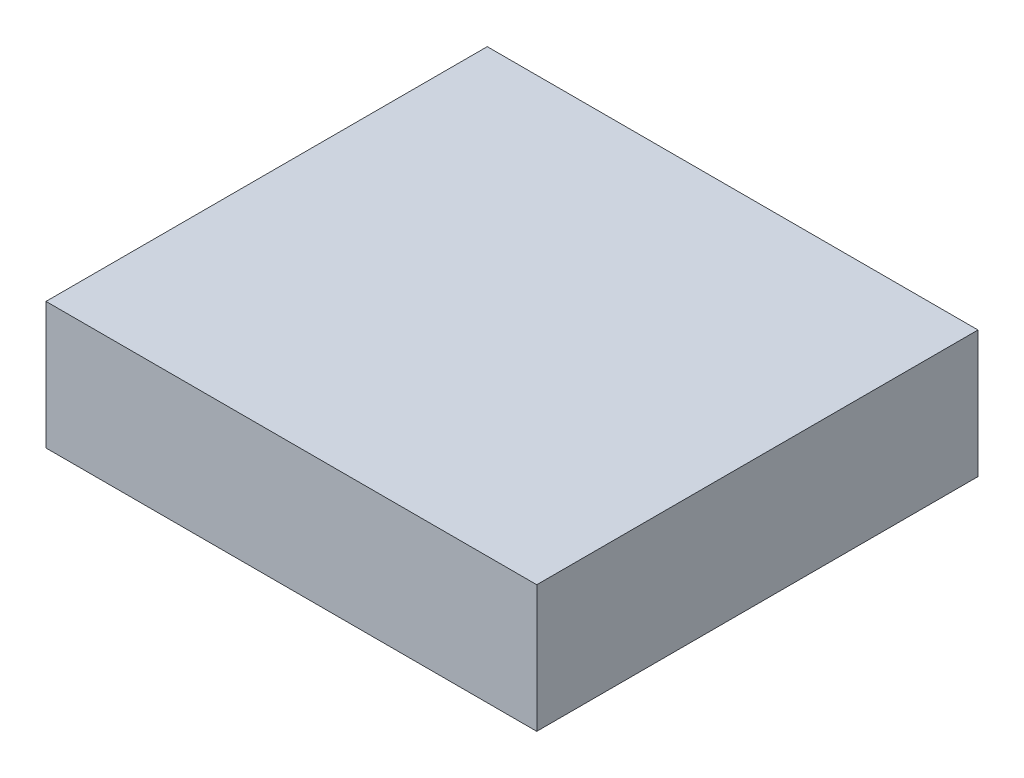
ISO-10303-21;
HEADER;
FILE_DESCRIPTION(('STEP AP214'),'2;1');
FILE_NAME('part.step','',(''),(''),'','','');
FILE_SCHEMA(('AUTOMOTIVE_DESIGN { 1 0 10303 214 1 1 1 1 }'));
ENDSEC;
DATA;
#1=APPLICATION_CONTEXT('core data for automotive mechanical design processes');
#2=APPLICATION_PROTOCOL_DEFINITION('international standard','automotive_design',2000,#1);
#3=PRODUCT_CONTEXT('',#1,'mechanical');
#4=PRODUCT('Part','Part','',(#3));
#5=PRODUCT_RELATED_PRODUCT_CATEGORY('part','',(#4));
#6=PRODUCT_DEFINITION_FORMATION('','',#4);
#7=PRODUCT_DEFINITION_CONTEXT('part definition',#1,'design');
#8=PRODUCT_DEFINITION('design','',#6,#7);
#9=PRODUCT_DEFINITION_SHAPE('','',#8);
#10=(LENGTH_UNIT() NAMED_UNIT(*) SI_UNIT(.MILLI.,.METRE.));
#11=(NAMED_UNIT(*) PLANE_ANGLE_UNIT() SI_UNIT($,.RADIAN.));
#12=(NAMED_UNIT(*) SI_UNIT($,.STERADIAN.) SOLID_ANGLE_UNIT());
#13=UNCERTAINTY_MEASURE_WITH_UNIT(LENGTH_MEASURE(1.E-05),#10,'distance_accuracy_value','');
#14=(GEOMETRIC_REPRESENTATION_CONTEXT(3) GLOBAL_UNCERTAINTY_ASSIGNED_CONTEXT((#13)) GLOBAL_UNIT_ASSIGNED_CONTEXT((#10,
#11,#12)) REPRESENTATION_CONTEXT('',''));
#15=CARTESIAN_POINT('',(0.,0.,0.));
#16=DIRECTION('',(0.,0.,1.));
#17=DIRECTION('',(1.,0.,0.));
#18=AXIS2_PLACEMENT_3D('',#15,#16,#17);
#19=CARTESIAN_POINT('',(0.,14.986,0.));
#20=DIRECTION('',(1.,0.,0.));
#21=DIRECTION('',(0.,0.,-1.));
#22=AXIS2_PLACEMENT_3D('',#19,#20,#21);
#23=PLANE('',#22);
#24=DIRECTION('',(0.,0.,1.));
#25=VECTOR('',#24,1.);
#26=CARTESIAN_POINT('',(0.,0.,0.));
#27=LINE('',#26,#25);
#28=CARTESIAN_POINT('',(0.,0.,-52.07));
#29=VERTEX_POINT('',#28);
#30=CARTESIAN_POINT('',(0.,0.,0.));
#31=VERTEX_POINT('',#30);
#32=EDGE_CURVE('E111',#29,#31,#27,.T.);
#33=ORIENTED_EDGE('',*,*,#32,.T.);
#34=DIRECTION('',(0.,-1.,0.));
#35=VECTOR('',#34,1.);
#36=CARTESIAN_POINT('',(0.,14.986,0.));
#37=LINE('',#36,#35);
#38=CARTESIAN_POINT('',(0.,14.986,0.));
#39=VERTEX_POINT('',#38);
#40=EDGE_CURVE('E11',#39,#31,#37,.T.);
#41=ORIENTED_EDGE('',*,*,#40,.F.);
#42=DIRECTION('',(0.,0.,1.));
#43=VECTOR('',#42,1.);
#44=CARTESIAN_POINT('',(0.,14.986,0.));
#45=LINE('',#44,#43);
#46=CARTESIAN_POINT('',(0.,14.986,-52.07));
#47=VERTEX_POINT('',#46);
#48=EDGE_CURVE('E95',#47,#39,#45,.T.);
#49=ORIENTED_EDGE('',*,*,#48,.F.);
#50=DIRECTION('',(0.,-1.,0.));
#51=VECTOR('',#50,1.);
#52=CARTESIAN_POINT('',(0.,14.986,-52.07));
#53=LINE('',#52,#51);
#54=EDGE_CURVE('E107',#47,#29,#53,.T.);
#55=ORIENTED_EDGE('',*,*,#54,.T.);
#56=EDGE_LOOP('',(#33,#41,#49,#55));
#57=FACE_BOUND('',#56,.T.);
#58=ADVANCED_FACE('F43',(#57),#23,.F.);
#59=CARTESIAN_POINT('',(0.,14.986,0.));
#60=DIRECTION('',(0.,0.,-1.));
#61=DIRECTION('',(-1.,0.,0.));
#62=AXIS2_PLACEMENT_3D('',#59,#60,#61);
#63=PLANE('',#62);
#64=DIRECTION('',(1.,0.,0.));
#65=VECTOR('',#64,1.);
#66=CARTESIAN_POINT('',(0.,0.,0.));
#67=LINE('',#66,#65);
#68=CARTESIAN_POINT('',(57.912,0.,0.));
#69=VERTEX_POINT('',#68);
#70=EDGE_CURVE('E100',#31,#69,#67,.T.);
#71=ORIENTED_EDGE('',*,*,#70,.T.);
#72=DIRECTION('',(0.,-1.,0.));
#73=VECTOR('',#72,1.);
#74=CARTESIAN_POINT('',(57.912,14.986,0.));
#75=LINE('',#74,#73);
#76=CARTESIAN_POINT('',(57.912,14.986,0.));
#77=VERTEX_POINT('',#76);
#78=EDGE_CURVE('E52',#77,#69,#75,.T.);
#79=ORIENTED_EDGE('',*,*,#78,.F.);
#80=DIRECTION('',(1.,0.,0.));
#81=VECTOR('',#80,1.);
#82=CARTESIAN_POINT('',(0.,14.986,0.));
#83=LINE('',#82,#81);
#84=EDGE_CURVE('E90',#39,#77,#83,.T.);
#85=ORIENTED_EDGE('',*,*,#84,.F.);
#86=ORIENTED_EDGE('',*,*,#40,.T.);
#87=EDGE_LOOP('',(#71,#79,#85,#86));
#88=FACE_BOUND('',#87,.T.);
#89=ADVANCED_FACE('F99',(#88),#63,.F.);
#90=CARTESIAN_POINT('',(57.912,14.986,0.));
#91=DIRECTION('',(-1.,0.,0.));
#92=DIRECTION('',(0.,0.,1.));
#93=AXIS2_PLACEMENT_3D('',#90,#91,#92);
#94=PLANE('',#93);
#95=DIRECTION('',(0.,0.,-1.));
#96=VECTOR('',#95,1.);
#97=CARTESIAN_POINT('',(57.912,0.,0.));
#98=LINE('',#97,#96);
#99=CARTESIAN_POINT('',(57.912,0.,-52.07));
#100=VERTEX_POINT('',#99);
#101=EDGE_CURVE('E77',#69,#100,#98,.T.);
#102=ORIENTED_EDGE('',*,*,#101,.T.);
#103=DIRECTION('',(0.,-1.,0.));
#104=VECTOR('',#103,1.);
#105=CARTESIAN_POINT('',(57.912,14.986,-52.07));
#106=LINE('',#105,#104);
#107=CARTESIAN_POINT('',(57.912,14.986,-52.07));
#108=VERTEX_POINT('',#107);
#109=EDGE_CURVE('E102',#108,#100,#106,.T.);
#110=ORIENTED_EDGE('',*,*,#109,.F.);
#111=DIRECTION('',(0.,0.,-1.));
#112=VECTOR('',#111,1.);
#113=CARTESIAN_POINT('',(57.912,14.986,0.));
#114=LINE('',#113,#112);
#115=EDGE_CURVE('E93',#77,#108,#114,.T.);
#116=ORIENTED_EDGE('',*,*,#115,.F.);
#117=ORIENTED_EDGE('',*,*,#78,.T.);
#118=EDGE_LOOP('',(#102,#110,#116,#117));
#119=FACE_BOUND('',#118,.T.);
#120=ADVANCED_FACE('F103',(#119),#94,.F.);
#121=CARTESIAN_POINT('',(0.,14.986,-52.07));
#122=DIRECTION('',(0.,0.,1.));
#123=DIRECTION('',(1.,0.,0.));
#124=AXIS2_PLACEMENT_3D('',#121,#122,#123);
#125=PLANE('',#124);
#126=DIRECTION('',(-1.,0.,0.));
#127=VECTOR('',#126,1.);
#128=CARTESIAN_POINT('',(0.,0.,-52.07));
#129=LINE('',#128,#127);
#130=EDGE_CURVE('E83',#100,#29,#129,.T.);
#131=ORIENTED_EDGE('',*,*,#130,.T.);
#132=ORIENTED_EDGE('',*,*,#54,.F.);
#133=DIRECTION('',(-1.,0.,0.));
#134=VECTOR('',#133,1.);
#135=CARTESIAN_POINT('',(0.,14.986,-52.07));
#136=LINE('',#135,#134);
#137=EDGE_CURVE('E60',#108,#47,#136,.T.);
#138=ORIENTED_EDGE('',*,*,#137,.F.);
#139=ORIENTED_EDGE('',*,*,#109,.T.);
#140=EDGE_LOOP('',(#131,#132,#138,#139));
#141=FACE_BOUND('',#140,.T.);
#142=ADVANCED_FACE('F124',(#141),#125,.F.);
#143=CARTESIAN_POINT('',(0.,14.986,0.));
#144=DIRECTION('',(0.,-1.,0.));
#145=DIRECTION('',(0.,0.,-1.));
#146=AXIS2_PLACEMENT_3D('',#143,#144,#145);
#147=PLANE('',#146);
#148=ORIENTED_EDGE('',*,*,#48,.T.);
#149=ORIENTED_EDGE('',*,*,#84,.T.);
#150=ORIENTED_EDGE('',*,*,#115,.T.);
#151=ORIENTED_EDGE('',*,*,#137,.T.);
#152=EDGE_LOOP('',(#148,#149,#150,#151));
#153=FACE_BOUND('',#152,.T.);
#154=ADVANCED_FACE('F91',(#153),#147,.F.);
#155=CARTESIAN_POINT('',(0.,0.,0.));
#156=DIRECTION('',(0.,-1.,0.));
#157=DIRECTION('',(0.,0.,-1.));
#158=AXIS2_PLACEMENT_3D('',#155,#156,#157);
#159=PLANE('',#158);
#160=ORIENTED_EDGE('',*,*,#32,.F.);
#161=ORIENTED_EDGE('',*,*,#130,.F.);
#162=ORIENTED_EDGE('',*,*,#101,.F.);
#163=ORIENTED_EDGE('',*,*,#70,.F.);
#164=EDGE_LOOP('',(#160,#161,#162,#163));
#165=FACE_BOUND('',#164,.T.);
#166=ADVANCED_FACE('F127',(#165),#159,.T.);
#167=CLOSED_SHELL('',(#58,#89,#120,#142,#154,#166));
#168=MANIFOLD_SOLID_BREP('B2',#167);
#169=ADVANCED_BREP_SHAPE_REPRESENTATION('',(#18,#168),#14);
#170=SHAPE_DEFINITION_REPRESENTATION(#9,#169);
ENDSEC;
END-ISO-10303-21;
